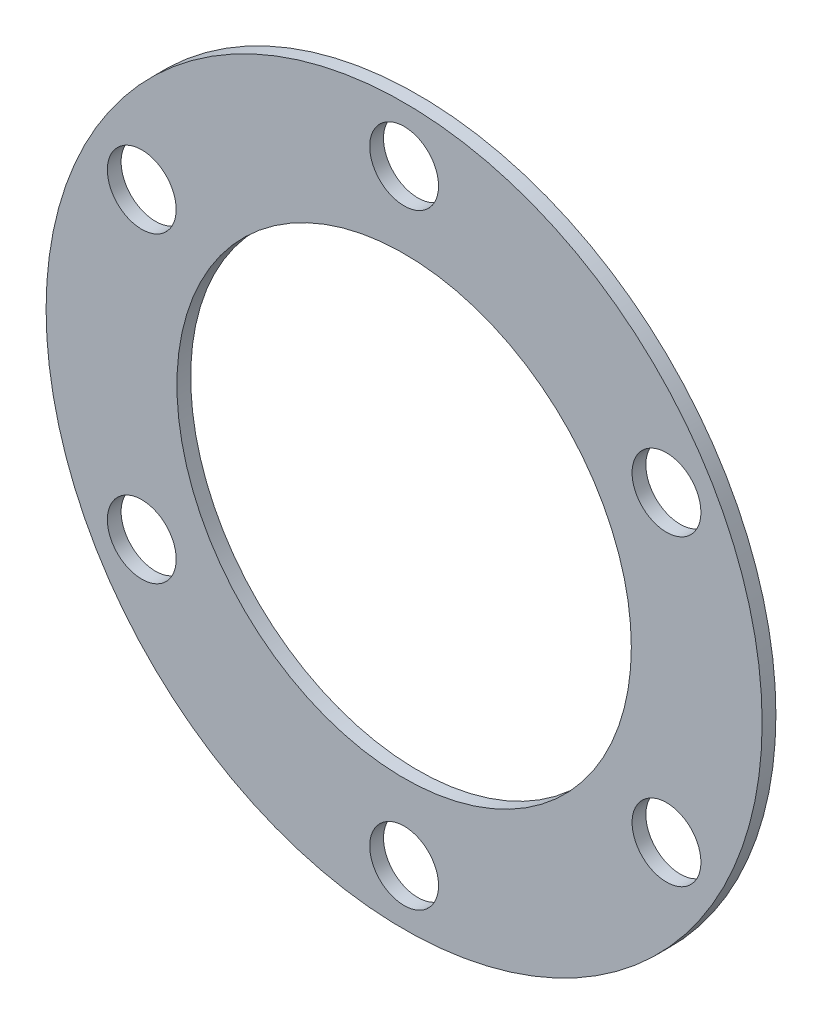
ISO-10303-21;
HEADER;
FILE_DESCRIPTION(('STEP AP214'),'2;1');
FILE_NAME('part.step','',(''),(''),'','','');
FILE_SCHEMA(('AUTOMOTIVE_DESIGN { 1 0 10303 214 1 1 1 1 }'));
ENDSEC;
DATA;
#1=APPLICATION_CONTEXT('core data for automotive mechanical design processes');
#2=APPLICATION_PROTOCOL_DEFINITION('international standard','automotive_design',2000,#1);
#3=PRODUCT_CONTEXT('',#1,'mechanical');
#4=PRODUCT('Part','Part','',(#3));
#5=PRODUCT_RELATED_PRODUCT_CATEGORY('part','',(#4));
#6=PRODUCT_DEFINITION_FORMATION('','',#4);
#7=PRODUCT_DEFINITION_CONTEXT('part definition',#1,'design');
#8=PRODUCT_DEFINITION('design','',#6,#7);
#9=PRODUCT_DEFINITION_SHAPE('','',#8);
#10=(LENGTH_UNIT() NAMED_UNIT(*) SI_UNIT(.MILLI.,.METRE.));
#11=(NAMED_UNIT(*) PLANE_ANGLE_UNIT() SI_UNIT($,.RADIAN.));
#12=(NAMED_UNIT(*) SI_UNIT($,.STERADIAN.) SOLID_ANGLE_UNIT());
#13=UNCERTAINTY_MEASURE_WITH_UNIT(LENGTH_MEASURE(1.E-05),#10,'distance_accuracy_value','');
#14=(GEOMETRIC_REPRESENTATION_CONTEXT(3) GLOBAL_UNCERTAINTY_ASSIGNED_CONTEXT((#13)) GLOBAL_UNIT_ASSIGNED_CONTEXT((#10,
#11,#12)) REPRESENTATION_CONTEXT('',''));
#15=CARTESIAN_POINT('',(0.,0.,0.));
#16=DIRECTION('',(0.,0.,1.));
#17=DIRECTION('',(1.,0.,0.));
#18=AXIS2_PLACEMENT_3D('',#15,#16,#17);
#19=CARTESIAN_POINT('',(0.,0.,1.));
#20=DIRECTION('',(0.,0.,1.));
#21=DIRECTION('',(1.,0.,0.));
#22=AXIS2_PLACEMENT_3D('',#19,#20,#21);
#23=PLANE('',#22);
#24=CARTESIAN_POINT('',(-19.0510588832549,-11.0008660254052,1.));
#25=DIRECTION('',(0.,0.,1.));
#26=DIRECTION('',(1.,0.,0.));
#27=AXIS2_PLACEMENT_3D('',#24,#25,#26);
#28=CIRCLE('',#27,2.5);
#29=CARTESIAN_POINT('',(-16.5510588832549,-11.0008660254052,1.));
#30=VERTEX_POINT('',#29);
#31=EDGE_CURVE('E73',#30,#30,#28,.T.);
#32=ORIENTED_EDGE('',*,*,#31,.F.);
#33=EDGE_LOOP('',(#32));
#34=FACE_BOUND('',#33,.T.);
#35=CARTESIAN_POINT('',(19.0540588832604,-10.9991339745947,1.));
#36=DIRECTION('',(0.,0.,1.));
#37=DIRECTION('',(1.,0.,0.));
#38=AXIS2_PLACEMENT_3D('',#35,#36,#37);
#39=CIRCLE('',#38,2.5);
#40=CARTESIAN_POINT('',(21.5540588832604,-10.9991339745947,1.));
#41=VERTEX_POINT('',#40);
#42=EDGE_CURVE('E61',#41,#41,#39,.T.);
#43=ORIENTED_EDGE('',*,*,#42,.F.);
#44=EDGE_LOOP('',(#43));
#45=FACE_BOUND('',#44,.T.);
#46=CARTESIAN_POINT('',(0.,22.,1.));
#47=DIRECTION('',(0.,0.,1.));
#48=DIRECTION('',(1.,0.,0.));
#49=AXIS2_PLACEMENT_3D('',#46,#47,#48);
#50=CIRCLE('',#49,2.5);
#51=CARTESIAN_POINT('',(2.5,22.,1.));
#52=VERTEX_POINT('',#51);
#53=EDGE_CURVE('E49',#52,#52,#50,.T.);
#54=ORIENTED_EDGE('',*,*,#53,.F.);
#55=EDGE_LOOP('',(#54));
#56=FACE_BOUND('',#55,.T.);
#57=CARTESIAN_POINT('',(0.,0.,1.));
#58=DIRECTION('',(0.,0.,1.));
#59=DIRECTION('',(1.,0.,0.));
#60=AXIS2_PLACEMENT_3D('',#57,#58,#59);
#61=CIRCLE('',#60,26.);
#62=CARTESIAN_POINT('',(26.,0.,1.));
#63=VERTEX_POINT('',#62);
#64=EDGE_CURVE('E10',#63,#63,#61,.T.);
#65=ORIENTED_EDGE('',*,*,#64,.T.);
#66=EDGE_LOOP('',(#65));
#67=FACE_BOUND('',#66,.T.);
#68=CARTESIAN_POINT('',(0.,0.,1.));
#69=DIRECTION('',(0.,0.,1.));
#70=DIRECTION('',(1.,0.,0.));
#71=AXIS2_PLACEMENT_3D('',#68,#69,#70);
#72=CIRCLE('',#71,16.5);
#73=CARTESIAN_POINT('',(16.5,0.,1.));
#74=VERTEX_POINT('',#73);
#75=EDGE_CURVE('E44',#74,#74,#72,.T.);
#76=ORIENTED_EDGE('',*,*,#75,.F.);
#77=EDGE_LOOP('',(#76));
#78=FACE_BOUND('',#77,.T.);
#79=CARTESIAN_POINT('',(19.0530588832586,11.0008660254054,1.));
#80=DIRECTION('',(0.,0.,1.));
#81=DIRECTION('',(1.,0.,0.));
#82=AXIS2_PLACEMENT_3D('',#79,#80,#81);
#83=CIRCLE('',#82,2.5);
#84=CARTESIAN_POINT('',(21.5530588832586,11.0008660254054,1.));
#85=VERTEX_POINT('',#84);
#86=EDGE_CURVE('E55',#85,#85,#83,.T.);
#87=ORIENTED_EDGE('',*,*,#86,.F.);
#88=EDGE_LOOP('',(#87));
#89=FACE_BOUND('',#88,.T.);
#90=CARTESIAN_POINT('',(0.00200000000360557,-22.,1.));
#91=DIRECTION('',(0.,0.,1.));
#92=DIRECTION('',(1.,0.,0.));
#93=AXIS2_PLACEMENT_3D('',#90,#91,#92);
#94=CIRCLE('',#93,2.5);
#95=CARTESIAN_POINT('',(2.50200000000361,-22.,1.));
#96=VERTEX_POINT('',#95);
#97=EDGE_CURVE('E67',#96,#96,#94,.T.);
#98=ORIENTED_EDGE('',*,*,#97,.F.);
#99=EDGE_LOOP('',(#98));
#100=FACE_BOUND('',#99,.T.);
#101=CARTESIAN_POINT('',(-19.0520588832566,10.9991339745948,1.));
#102=DIRECTION('',(0.,0.,1.));
#103=DIRECTION('',(1.,0.,0.));
#104=AXIS2_PLACEMENT_3D('',#101,#102,#103);
#105=CIRCLE('',#104,2.5);
#106=CARTESIAN_POINT('',(-16.5520588832566,10.9991339745948,1.));
#107=VERTEX_POINT('',#106);
#108=EDGE_CURVE('E79',#107,#107,#105,.T.);
#109=ORIENTED_EDGE('',*,*,#108,.F.);
#110=EDGE_LOOP('',(#109));
#111=FACE_BOUND('',#110,.T.);
#112=ADVANCED_FACE('F33',(#34,#45,#56,#67,#78,#89,#100,#111),#23,.T.);
#113=CARTESIAN_POINT('',(0.,0.,0.));
#114=DIRECTION('',(0.,0.,1.));
#115=DIRECTION('',(1.,0.,0.));
#116=AXIS2_PLACEMENT_3D('',#113,#114,#115);
#117=PLANE('',#116);
#118=CARTESIAN_POINT('',(0.,0.,0.));
#119=DIRECTION('',(0.,0.,1.));
#120=DIRECTION('',(1.,0.,0.));
#121=AXIS2_PLACEMENT_3D('',#118,#119,#120);
#122=CIRCLE('',#121,26.);
#123=CARTESIAN_POINT('',(26.,0.,0.));
#124=VERTEX_POINT('',#123);
#125=EDGE_CURVE('E37',#124,#124,#122,.T.);
#126=ORIENTED_EDGE('',*,*,#125,.F.);
#127=EDGE_LOOP('',(#126));
#128=FACE_BOUND('',#127,.T.);
#129=CARTESIAN_POINT('',(0.,0.,0.));
#130=DIRECTION('',(0.,0.,1.));
#131=DIRECTION('',(1.,0.,0.));
#132=AXIS2_PLACEMENT_3D('',#129,#130,#131);
#133=CIRCLE('',#132,16.5);
#134=CARTESIAN_POINT('',(16.5,0.,0.));
#135=VERTEX_POINT('',#134);
#136=EDGE_CURVE('E46',#135,#135,#133,.T.);
#137=ORIENTED_EDGE('',*,*,#136,.T.);
#138=EDGE_LOOP('',(#137));
#139=FACE_BOUND('',#138,.T.);
#140=CARTESIAN_POINT('',(0.,22.,0.));
#141=DIRECTION('',(0.,0.,1.));
#142=DIRECTION('',(1.,0.,0.));
#143=AXIS2_PLACEMENT_3D('',#140,#141,#142);
#144=CIRCLE('',#143,2.5);
#145=CARTESIAN_POINT('',(2.5,22.,0.));
#146=VERTEX_POINT('',#145);
#147=EDGE_CURVE('E52',#146,#146,#144,.T.);
#148=ORIENTED_EDGE('',*,*,#147,.T.);
#149=EDGE_LOOP('',(#148));
#150=FACE_BOUND('',#149,.T.);
#151=CARTESIAN_POINT('',(19.0530588832586,11.0008660254054,0.));
#152=DIRECTION('',(0.,0.,1.));
#153=DIRECTION('',(1.,0.,0.));
#154=AXIS2_PLACEMENT_3D('',#151,#152,#153);
#155=CIRCLE('',#154,2.5);
#156=CARTESIAN_POINT('',(21.5530588832586,11.0008660254054,0.));
#157=VERTEX_POINT('',#156);
#158=EDGE_CURVE('E58',#157,#157,#155,.T.);
#159=ORIENTED_EDGE('',*,*,#158,.T.);
#160=EDGE_LOOP('',(#159));
#161=FACE_BOUND('',#160,.T.);
#162=CARTESIAN_POINT('',(19.0540588832604,-10.9991339745947,0.));
#163=DIRECTION('',(0.,0.,1.));
#164=DIRECTION('',(1.,0.,0.));
#165=AXIS2_PLACEMENT_3D('',#162,#163,#164);
#166=CIRCLE('',#165,2.5);
#167=CARTESIAN_POINT('',(21.5540588832604,-10.9991339745947,0.));
#168=VERTEX_POINT('',#167);
#169=EDGE_CURVE('E64',#168,#168,#166,.T.);
#170=ORIENTED_EDGE('',*,*,#169,.T.);
#171=EDGE_LOOP('',(#170));
#172=FACE_BOUND('',#171,.T.);
#173=CARTESIAN_POINT('',(0.00200000000360557,-22.,0.));
#174=DIRECTION('',(0.,0.,1.));
#175=DIRECTION('',(1.,0.,0.));
#176=AXIS2_PLACEMENT_3D('',#173,#174,#175);
#177=CIRCLE('',#176,2.5);
#178=CARTESIAN_POINT('',(2.50200000000361,-22.,0.));
#179=VERTEX_POINT('',#178);
#180=EDGE_CURVE('E70',#179,#179,#177,.T.);
#181=ORIENTED_EDGE('',*,*,#180,.T.);
#182=EDGE_LOOP('',(#181));
#183=FACE_BOUND('',#182,.T.);
#184=CARTESIAN_POINT('',(-19.0510588832549,-11.0008660254052,0.));
#185=DIRECTION('',(0.,0.,1.));
#186=DIRECTION('',(1.,0.,0.));
#187=AXIS2_PLACEMENT_3D('',#184,#185,#186);
#188=CIRCLE('',#187,2.5);
#189=CARTESIAN_POINT('',(-16.5510588832549,-11.0008660254052,0.));
#190=VERTEX_POINT('',#189);
#191=EDGE_CURVE('E76',#190,#190,#188,.T.);
#192=ORIENTED_EDGE('',*,*,#191,.T.);
#193=EDGE_LOOP('',(#192));
#194=FACE_BOUND('',#193,.T.);
#195=CARTESIAN_POINT('',(-19.0520588832566,10.9991339745948,0.));
#196=DIRECTION('',(0.,0.,1.));
#197=DIRECTION('',(1.,0.,0.));
#198=AXIS2_PLACEMENT_3D('',#195,#196,#197);
#199=CIRCLE('',#198,2.5);
#200=CARTESIAN_POINT('',(-16.5520588832566,10.9991339745948,0.));
#201=VERTEX_POINT('',#200);
#202=EDGE_CURVE('E82',#201,#201,#199,.T.);
#203=ORIENTED_EDGE('',*,*,#202,.T.);
#204=EDGE_LOOP('',(#203));
#205=FACE_BOUND('',#204,.T.);
#206=ADVANCED_FACE('F92',(#128,#139,#150,#161,#172,#183,#194,#205),#117,.F.);
#207=CARTESIAN_POINT('',(0.,0.,1.));
#208=DIRECTION('',(0.,0.,-1.));
#209=DIRECTION('',(-1.,0.,0.));
#210=AXIS2_PLACEMENT_3D('',#207,#208,#209);
#211=CYLINDRICAL_SURFACE('',#210,26.);
#212=ORIENTED_EDGE('',*,*,#64,.F.);
#213=EDGE_LOOP('',(#212));
#214=FACE_BOUND('',#213,.T.);
#215=ORIENTED_EDGE('',*,*,#125,.T.);
#216=EDGE_LOOP('',(#215));
#217=FACE_BOUND('',#216,.T.);
#218=ADVANCED_FACE('F35',(#214,#217),#211,.T.);
#219=CARTESIAN_POINT('',(0.,0.,1.));
#220=DIRECTION('',(0.,0.,-1.));
#221=DIRECTION('',(-1.,0.,0.));
#222=AXIS2_PLACEMENT_3D('',#219,#220,#221);
#223=CYLINDRICAL_SURFACE('',#222,16.5);
#224=ORIENTED_EDGE('',*,*,#75,.T.);
#225=EDGE_LOOP('',(#224));
#226=FACE_BOUND('',#225,.T.);
#227=ORIENTED_EDGE('',*,*,#136,.F.);
#228=EDGE_LOOP('',(#227));
#229=FACE_BOUND('',#228,.T.);
#230=ADVANCED_FACE('F102',(#226,#229),#223,.F.);
#231=CARTESIAN_POINT('',(0.,22.,1.));
#232=DIRECTION('',(0.,0.,-1.));
#233=DIRECTION('',(-1.,0.,0.));
#234=AXIS2_PLACEMENT_3D('',#231,#232,#233);
#235=CYLINDRICAL_SURFACE('',#234,2.5);
#236=ORIENTED_EDGE('',*,*,#53,.T.);
#237=EDGE_LOOP('',(#236));
#238=FACE_BOUND('',#237,.T.);
#239=ORIENTED_EDGE('',*,*,#147,.F.);
#240=EDGE_LOOP('',(#239));
#241=FACE_BOUND('',#240,.T.);
#242=ADVANCED_FACE('F105',(#238,#241),#235,.F.);
#243=CARTESIAN_POINT('',(19.0530588832586,11.0008660254054,1.));
#244=DIRECTION('',(0.,0.,-1.));
#245=DIRECTION('',(-1.,0.,0.));
#246=AXIS2_PLACEMENT_3D('',#243,#244,#245);
#247=CYLINDRICAL_SURFACE('',#246,2.5);
#248=ORIENTED_EDGE('',*,*,#86,.T.);
#249=EDGE_LOOP('',(#248));
#250=FACE_BOUND('',#249,.T.);
#251=ORIENTED_EDGE('',*,*,#158,.F.);
#252=EDGE_LOOP('',(#251));
#253=FACE_BOUND('',#252,.T.);
#254=ADVANCED_FACE('F109',(#250,#253),#247,.F.);
#255=CARTESIAN_POINT('',(19.0540588832604,-10.9991339745947,1.));
#256=DIRECTION('',(0.,0.,-1.));
#257=DIRECTION('',(-1.,0.,0.));
#258=AXIS2_PLACEMENT_3D('',#255,#256,#257);
#259=CYLINDRICAL_SURFACE('',#258,2.5);
#260=ORIENTED_EDGE('',*,*,#42,.T.);
#261=EDGE_LOOP('',(#260));
#262=FACE_BOUND('',#261,.T.);
#263=ORIENTED_EDGE('',*,*,#169,.F.);
#264=EDGE_LOOP('',(#263));
#265=FACE_BOUND('',#264,.T.);
#266=ADVANCED_FACE('F113',(#262,#265),#259,.F.);
#267=CARTESIAN_POINT('',(0.00200000000360557,-22.,1.));
#268=DIRECTION('',(0.,0.,-1.));
#269=DIRECTION('',(-1.,0.,0.));
#270=AXIS2_PLACEMENT_3D('',#267,#268,#269);
#271=CYLINDRICAL_SURFACE('',#270,2.5);
#272=ORIENTED_EDGE('',*,*,#97,.T.);
#273=EDGE_LOOP('',(#272));
#274=FACE_BOUND('',#273,.T.);
#275=ORIENTED_EDGE('',*,*,#180,.F.);
#276=EDGE_LOOP('',(#275));
#277=FACE_BOUND('',#276,.T.);
#278=ADVANCED_FACE('F117',(#274,#277),#271,.F.);
#279=CARTESIAN_POINT('',(-19.0510588832549,-11.0008660254052,1.));
#280=DIRECTION('',(0.,0.,-1.));
#281=DIRECTION('',(-1.,0.,0.));
#282=AXIS2_PLACEMENT_3D('',#279,#280,#281);
#283=CYLINDRICAL_SURFACE('',#282,2.5);
#284=ORIENTED_EDGE('',*,*,#31,.T.);
#285=EDGE_LOOP('',(#284));
#286=FACE_BOUND('',#285,.T.);
#287=ORIENTED_EDGE('',*,*,#191,.F.);
#288=EDGE_LOOP('',(#287));
#289=FACE_BOUND('',#288,.T.);
#290=ADVANCED_FACE('F121',(#286,#289),#283,.F.);
#291=CARTESIAN_POINT('',(-19.0520588832566,10.9991339745948,1.));
#292=DIRECTION('',(0.,0.,-1.));
#293=DIRECTION('',(-1.,0.,0.));
#294=AXIS2_PLACEMENT_3D('',#291,#292,#293);
#295=CYLINDRICAL_SURFACE('',#294,2.5);
#296=ORIENTED_EDGE('',*,*,#108,.T.);
#297=EDGE_LOOP('',(#296));
#298=FACE_BOUND('',#297,.T.);
#299=ORIENTED_EDGE('',*,*,#202,.F.);
#300=EDGE_LOOP('',(#299));
#301=FACE_BOUND('',#300,.T.);
#302=ADVANCED_FACE('F88',(#298,#301),#295,.F.);
#303=CLOSED_SHELL('',(#112,#206,#218,#230,#242,#254,#266,#278,#290,#302));
#304=MANIFOLD_SOLID_BREP('B2',#303);
#305=ADVANCED_BREP_SHAPE_REPRESENTATION('',(#18,#304),#14);
#306=SHAPE_DEFINITION_REPRESENTATION(#9,#305);
ENDSEC;
END-ISO-10303-21;
